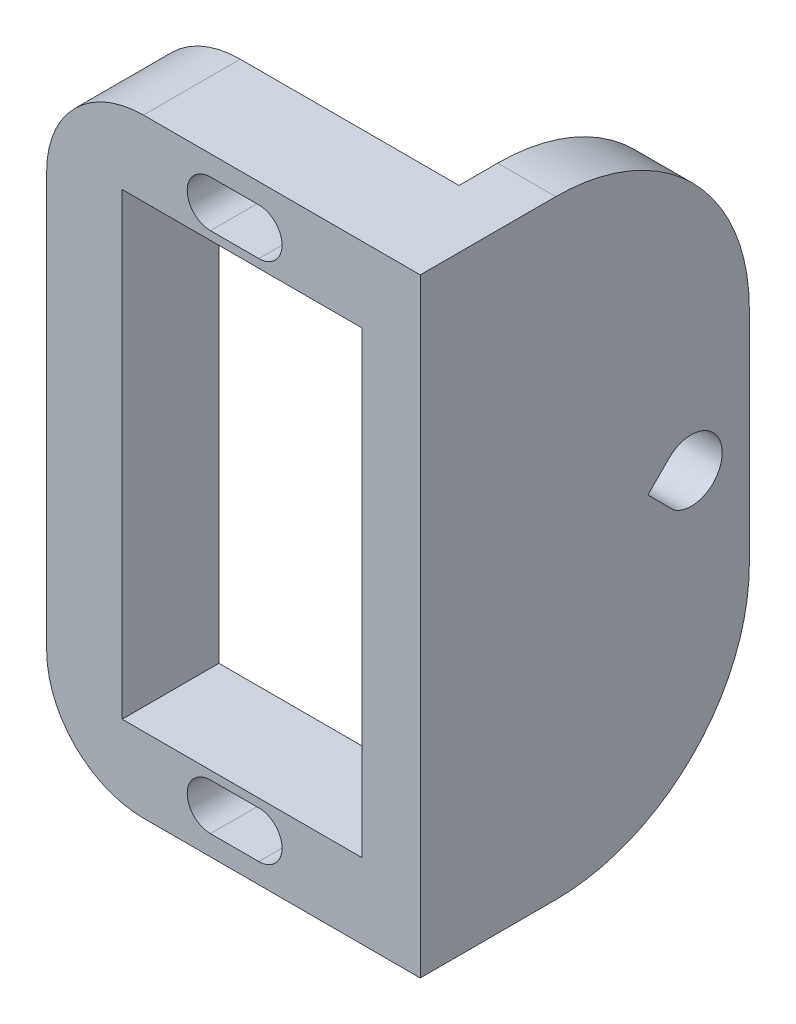
ISO-10303-21;
HEADER;
FILE_DESCRIPTION(('STEP AP214'),'2;1');
FILE_NAME('part.step','',(''),(''),'','','');
FILE_SCHEMA(('AUTOMOTIVE_DESIGN { 1 0 10303 214 1 1 1 1 }'));
ENDSEC;
DATA;
#1=APPLICATION_CONTEXT('core data for automotive mechanical design processes');
#2=APPLICATION_PROTOCOL_DEFINITION('international standard','automotive_design',2000,#1);
#3=PRODUCT_CONTEXT('',#1,'mechanical');
#4=PRODUCT('Part','Part','',(#3));
#5=PRODUCT_RELATED_PRODUCT_CATEGORY('part','',(#4));
#6=PRODUCT_DEFINITION_FORMATION('','',#4);
#7=PRODUCT_DEFINITION_CONTEXT('part definition',#1,'design');
#8=PRODUCT_DEFINITION('design','',#6,#7);
#9=PRODUCT_DEFINITION_SHAPE('','',#8);
#10=(LENGTH_UNIT() NAMED_UNIT(*) SI_UNIT(.MILLI.,.METRE.));
#11=(NAMED_UNIT(*) PLANE_ANGLE_UNIT() SI_UNIT($,.RADIAN.));
#12=(NAMED_UNIT(*) SI_UNIT($,.STERADIAN.) SOLID_ANGLE_UNIT());
#13=UNCERTAINTY_MEASURE_WITH_UNIT(LENGTH_MEASURE(1.E-05),#10,'distance_accuracy_value','');
#14=(GEOMETRIC_REPRESENTATION_CONTEXT(3) GLOBAL_UNCERTAINTY_ASSIGNED_CONTEXT((#13)) GLOBAL_UNIT_ASSIGNED_CONTEXT((#10,
#11,#12)) REPRESENTATION_CONTEXT('',''));
#15=CARTESIAN_POINT('',(0.,0.,0.));
#16=DIRECTION('',(0.,0.,1.));
#17=DIRECTION('',(1.,0.,0.));
#18=AXIS2_PLACEMENT_3D('',#15,#16,#17);
#19=CARTESIAN_POINT('',(12.4,11.85,5.));
#20=DIRECTION('',(0.,1.,0.));
#21=DIRECTION('',(0.,0.,1.));
#22=AXIS2_PLACEMENT_3D('',#19,#20,#21);
#23=PLANE('',#22);
#24=DIRECTION('',(0.,0.,-1.));
#25=VECTOR('',#24,1.);
#26=CARTESIAN_POINT('',(12.4,11.85,5.));
#27=LINE('',#26,#25);
#28=CARTESIAN_POINT('',(12.4,11.85,5.));
#29=VERTEX_POINT('',#28);
#30=CARTESIAN_POINT('',(12.4,11.85,0.));
#31=VERTEX_POINT('',#30);
#32=EDGE_CURVE('E263',#29,#31,#27,.T.);
#33=ORIENTED_EDGE('',*,*,#32,.F.);
#34=DIRECTION('',(1.,0.,0.));
#35=VECTOR('',#34,1.);
#36=CARTESIAN_POINT('',(0.,11.85,5.));
#37=LINE('',#36,#35);
#38=CARTESIAN_POINT('',(0.,11.85,5.));
#39=VERTEX_POINT('',#38);
#40=EDGE_CURVE('E381',#39,#29,#37,.T.);
#41=ORIENTED_EDGE('',*,*,#40,.F.);
#42=DIRECTION('',(0.,0.,-1.));
#43=VECTOR('',#42,1.);
#44=CARTESIAN_POINT('',(0.,11.85,5.));
#45=LINE('',#44,#43);
#46=CARTESIAN_POINT('',(0.,11.85,0.));
#47=VERTEX_POINT('',#46);
#48=EDGE_CURVE('E404',#39,#47,#45,.T.);
#49=ORIENTED_EDGE('',*,*,#48,.T.);
#50=DIRECTION('',(1.,0.,0.));
#51=VECTOR('',#50,1.);
#52=CARTESIAN_POINT('',(12.4,11.85,0.));
#53=LINE('',#52,#51);
#54=EDGE_CURVE('E329',#47,#31,#53,.T.);
#55=ORIENTED_EDGE('',*,*,#54,.T.);
#56=EDGE_LOOP('',(#33,#41,#49,#55));
#57=FACE_BOUND('',#56,.T.);
#58=ADVANCED_FACE('F47',(#57),#23,.F.);
#59=CARTESIAN_POINT('',(0.,-11.85,5.));
#60=DIRECTION('',(0.,-1.,0.));
#61=DIRECTION('',(1.,0.,0.));
#62=AXIS2_PLACEMENT_3D('',#59,#60,#61);
#63=PLANE('',#62);
#64=DIRECTION('',(0.,0.,-1.));
#65=VECTOR('',#64,1.);
#66=CARTESIAN_POINT('',(12.4,-11.85,5.));
#67=LINE('',#66,#65);
#68=CARTESIAN_POINT('',(12.4,-11.85,5.));
#69=VERTEX_POINT('',#68);
#70=CARTESIAN_POINT('',(12.4,-11.85,0.));
#71=VERTEX_POINT('',#70);
#72=EDGE_CURVE('E266',#69,#71,#67,.T.);
#73=ORIENTED_EDGE('',*,*,#72,.T.);
#74=DIRECTION('',(-1.,0.,0.));
#75=VECTOR('',#74,1.);
#76=CARTESIAN_POINT('',(0.,-11.85,0.));
#77=LINE('',#76,#75);
#78=CARTESIAN_POINT('',(0.,-11.85,0.));
#79=VERTEX_POINT('',#78);
#80=EDGE_CURVE('E417',#71,#79,#77,.T.);
#81=ORIENTED_EDGE('',*,*,#80,.T.);
#82=DIRECTION('',(0.,0.,-1.));
#83=VECTOR('',#82,1.);
#84=CARTESIAN_POINT('',(0.,-11.85,5.));
#85=LINE('',#84,#83);
#86=CARTESIAN_POINT('',(0.,-11.85,5.));
#87=VERTEX_POINT('',#86);
#88=EDGE_CURVE('E426',#87,#79,#85,.T.);
#89=ORIENTED_EDGE('',*,*,#88,.F.);
#90=DIRECTION('',(-1.,0.,0.));
#91=VECTOR('',#90,1.);
#92=CARTESIAN_POINT('',(12.4,-11.85,5.));
#93=LINE('',#92,#91);
#94=EDGE_CURVE('E398',#69,#87,#93,.T.);
#95=ORIENTED_EDGE('',*,*,#94,.F.);
#96=EDGE_LOOP('',(#73,#81,#89,#95));
#97=FACE_BOUND('',#96,.T.);
#98=ADVANCED_FACE('F547',(#97),#63,.F.);
#99=CARTESIAN_POINT('',(0.,0.,0.));
#100=DIRECTION('',(0.,0.,-1.));
#101=DIRECTION('',(-1.,0.,0.));
#102=AXIS2_PLACEMENT_3D('',#99,#100,#101);
#103=PLANE('',#102);
#104=CARTESIAN_POINT('',(4.56,-13.49,0.));
#105=DIRECTION('',(0.,0.,1.));
#106=DIRECTION('',(1.,0.,0.));
#107=AXIS2_PLACEMENT_3D('',#104,#105,#106);
#108=CIRCLE('',#107,1.2);
#109=CARTESIAN_POINT('',(4.56,-12.29,0.));
#110=VERTEX_POINT('',#109);
#111=CARTESIAN_POINT('',(4.56,-14.69,0.));
#112=VERTEX_POINT('',#111);
#113=EDGE_CURVE('E293',#110,#112,#108,.T.);
#114=ORIENTED_EDGE('',*,*,#113,.T.);
#115=DIRECTION('',(1.,0.,0.));
#116=VECTOR('',#115,1.);
#117=CARTESIAN_POINT('',(4.56,-14.69,0.));
#118=LINE('',#117,#116);
#119=CARTESIAN_POINT('',(7.06,-14.69,0.));
#120=VERTEX_POINT('',#119);
#121=EDGE_CURVE('E297',#112,#120,#118,.T.);
#122=ORIENTED_EDGE('',*,*,#121,.T.);
#123=CARTESIAN_POINT('',(7.06,-13.49,0.));
#124=DIRECTION('',(0.,0.,1.));
#125=DIRECTION('',(1.,0.,0.));
#126=AXIS2_PLACEMENT_3D('',#123,#124,#125);
#127=CIRCLE('',#126,1.2);
#128=CARTESIAN_POINT('',(7.06,-12.29,0.));
#129=VERTEX_POINT('',#128);
#130=EDGE_CURVE('E302',#120,#129,#127,.T.);
#131=ORIENTED_EDGE('',*,*,#130,.T.);
#132=DIRECTION('',(-1.,0.,0.));
#133=VECTOR('',#132,1.);
#134=CARTESIAN_POINT('',(4.56,-12.29,0.));
#135=LINE('',#134,#133);
#136=EDGE_CURVE('E306',#129,#110,#135,.T.);
#137=ORIENTED_EDGE('',*,*,#136,.T.);
#138=EDGE_LOOP('',(#114,#122,#131,#137));
#139=FACE_BOUND('',#138,.T.);
#140=CARTESIAN_POINT('',(4.56,13.49,0.));
#141=DIRECTION('',(0.,0.,1.));
#142=DIRECTION('',(-1.,0.,0.));
#143=AXIS2_PLACEMENT_3D('',#140,#141,#142);
#144=CIRCLE('',#143,1.2);
#145=CARTESIAN_POINT('',(4.56,14.69,0.));
#146=VERTEX_POINT('',#145);
#147=CARTESIAN_POINT('',(4.56,12.29,0.));
#148=VERTEX_POINT('',#147);
#149=EDGE_CURVE('E357',#146,#148,#144,.T.);
#150=ORIENTED_EDGE('',*,*,#149,.T.);
#151=DIRECTION('',(1.,0.,0.));
#152=VECTOR('',#151,1.);
#153=CARTESIAN_POINT('',(4.56,12.29,0.));
#154=LINE('',#153,#152);
#155=CARTESIAN_POINT('',(7.06,12.29,0.));
#156=VERTEX_POINT('',#155);
#157=EDGE_CURVE('E374',#148,#156,#154,.T.);
#158=ORIENTED_EDGE('',*,*,#157,.T.);
#159=CARTESIAN_POINT('',(7.06,13.49,0.));
#160=DIRECTION('',(0.,0.,1.));
#161=DIRECTION('',(-1.,0.,0.));
#162=AXIS2_PLACEMENT_3D('',#159,#160,#161);
#163=CIRCLE('',#162,1.2);
#164=CARTESIAN_POINT('',(7.06,14.69,0.));
#165=VERTEX_POINT('',#164);
#166=EDGE_CURVE('E370',#156,#165,#163,.T.);
#167=ORIENTED_EDGE('',*,*,#166,.T.);
#168=DIRECTION('',(-1.,0.,0.));
#169=VECTOR('',#168,1.);
#170=CARTESIAN_POINT('',(4.56,14.69,0.));
#171=LINE('',#170,#169);
#172=EDGE_CURVE('E343',#165,#146,#171,.T.);
#173=ORIENTED_EDGE('',*,*,#172,.T.);
#174=EDGE_LOOP('',(#150,#158,#167,#173));
#175=FACE_BOUND('',#174,.T.);
#176=DIRECTION('',(1.,0.,0.));
#177=VECTOR('',#176,1.);
#178=CARTESIAN_POINT('',(12.4,-15.73,0.));
#179=LINE('',#178,#177);
#180=CARTESIAN_POINT('',(1.1,-15.73,0.));
#181=VERTEX_POINT('',#180);
#182=CARTESIAN_POINT('',(12.4,-15.73,0.));
#183=VERTEX_POINT('',#182);
#184=EDGE_CURVE('E414',#181,#183,#179,.T.);
#185=ORIENTED_EDGE('',*,*,#184,.F.);
#186=CARTESIAN_POINT('',(1.1,-10.73,0.));
#187=DIRECTION('',(0.,0.,-1.));
#188=DIRECTION('',(-1.,0.,0.));
#189=AXIS2_PLACEMENT_3D('',#186,#187,#188);
#190=CIRCLE('',#189,5.);
#191=CARTESIAN_POINT('',(-3.9,-10.73,0.));
#192=VERTEX_POINT('',#191);
#193=EDGE_CURVE('E471',#181,#192,#190,.T.);
#194=ORIENTED_EDGE('',*,*,#193,.T.);
#195=DIRECTION('',(0.,-1.,0.));
#196=VECTOR('',#195,1.);
#197=CARTESIAN_POINT('',(-3.9,-15.73,0.));
#198=LINE('',#197,#196);
#199=CARTESIAN_POINT('',(-3.9,10.73,0.));
#200=VERTEX_POINT('',#199);
#201=EDGE_CURVE('E411',#200,#192,#198,.T.);
#202=ORIENTED_EDGE('',*,*,#201,.F.);
#203=CARTESIAN_POINT('',(1.1,10.73,0.));
#204=DIRECTION('',(0.,0.,-1.));
#205=DIRECTION('',(-1.,0.,0.));
#206=AXIS2_PLACEMENT_3D('',#203,#204,#205);
#207=CIRCLE('',#206,5.);
#208=CARTESIAN_POINT('',(1.1,15.73,0.));
#209=VERTEX_POINT('',#208);
#210=EDGE_CURVE('E468',#200,#209,#207,.T.);
#211=ORIENTED_EDGE('',*,*,#210,.T.);
#212=DIRECTION('',(-1.,0.,0.));
#213=VECTOR('',#212,1.);
#214=CARTESIAN_POINT('',(0.0999999999999994,15.73,0.));
#215=LINE('',#214,#213);
#216=CARTESIAN_POINT('',(12.4,15.73,0.));
#217=VERTEX_POINT('',#216);
#218=EDGE_CURVE('E408',#217,#209,#215,.T.);
#219=ORIENTED_EDGE('',*,*,#218,.F.);
#220=DIRECTION('',(0.,-1.,0.));
#221=VECTOR('',#220,1.);
#222=CARTESIAN_POINT('',(12.4,0.,0.));
#223=LINE('',#222,#221);
#224=EDGE_CURVE('E275',#217,#31,#223,.T.);
#225=ORIENTED_EDGE('',*,*,#224,.T.);
#226=ORIENTED_EDGE('',*,*,#54,.F.);
#227=DIRECTION('',(0.,1.,0.));
#228=VECTOR('',#227,1.);
#229=CARTESIAN_POINT('',(0.,-11.85,0.));
#230=LINE('',#229,#228);
#231=EDGE_CURVE('E386',#79,#47,#230,.T.);
#232=ORIENTED_EDGE('',*,*,#231,.F.);
#233=ORIENTED_EDGE('',*,*,#80,.F.);
#234=DIRECTION('',(0.,1.,0.));
#235=VECTOR('',#234,1.);
#236=CARTESIAN_POINT('',(12.4,-15.73,0.));
#237=LINE('',#236,#235);
#238=EDGE_CURVE('E283',#183,#71,#237,.T.);
#239=ORIENTED_EDGE('',*,*,#238,.F.);
#240=EDGE_LOOP('',(#185,#194,#202,#211,#219,#225,#226,#232,#233,#239));
#241=FACE_BOUND('',#240,.T.);
#242=ADVANCED_FACE('F497',(#139,#175,#241),#103,.T.);
#243=CARTESIAN_POINT('',(0.0999999999999994,15.73,5.));
#244=DIRECTION('',(0.,-1.,0.));
#245=DIRECTION('',(0.,0.,-1.));
#246=AXIS2_PLACEMENT_3D('',#243,#244,#245);
#247=PLANE('',#246);
#248=ORIENTED_EDGE('',*,*,#218,.T.);
#249=DIRECTION('',(0.,0.,-1.));
#250=VECTOR('',#249,1.);
#251=CARTESIAN_POINT('',(1.1,15.73,5.));
#252=LINE('',#251,#250);
#253=CARTESIAN_POINT('',(1.1,15.73,5.));
#254=VERTEX_POINT('',#253);
#255=EDGE_CURVE('E11',#209,#254,#252,.F.);
#256=ORIENTED_EDGE('',*,*,#255,.T.);
#257=DIRECTION('',(-1.,0.,0.));
#258=VECTOR('',#257,1.);
#259=CARTESIAN_POINT('',(12.4,15.73,5.));
#260=LINE('',#259,#258);
#261=CARTESIAN_POINT('',(15.4,15.73,5.));
#262=VERTEX_POINT('',#261);
#263=EDGE_CURVE('E389',#262,#254,#260,.T.);
#264=ORIENTED_EDGE('',*,*,#263,.F.);
#265=DIRECTION('',(0.,0.,-1.));
#266=VECTOR('',#265,1.);
#267=CARTESIAN_POINT('',(15.4,15.73,5.));
#268=LINE('',#267,#266);
#269=CARTESIAN_POINT('',(15.4,15.73,-2.));
#270=VERTEX_POINT('',#269);
#271=EDGE_CURVE('E434',#262,#270,#268,.T.);
#272=ORIENTED_EDGE('',*,*,#271,.T.);
#273=DIRECTION('',(1.,0.,0.));
#274=VECTOR('',#273,1.);
#275=CARTESIAN_POINT('',(12.4,15.73,-2.));
#276=LINE('',#275,#274);
#277=CARTESIAN_POINT('',(12.4,15.73,-2.));
#278=VERTEX_POINT('',#277);
#279=EDGE_CURVE('E461',#270,#278,#276,.F.);
#280=ORIENTED_EDGE('',*,*,#279,.T.);
#281=DIRECTION('',(0.,0.,1.));
#282=VECTOR('',#281,1.);
#283=CARTESIAN_POINT('',(12.4,15.73,-12.));
#284=LINE('',#283,#282);
#285=EDGE_CURVE('E279',#278,#217,#284,.T.);
#286=ORIENTED_EDGE('',*,*,#285,.T.);
#287=EDGE_LOOP('',(#248,#256,#264,#272,#280,#286));
#288=FACE_BOUND('',#287,.T.);
#289=ADVANCED_FACE('F504',(#288),#247,.F.);
#290=CARTESIAN_POINT('',(-3.9,-15.73,5.));
#291=DIRECTION('',(1.,0.,0.));
#292=DIRECTION('',(0.,0.,-1.));
#293=AXIS2_PLACEMENT_3D('',#290,#291,#292);
#294=PLANE('',#293);
#295=ORIENTED_EDGE('',*,*,#201,.T.);
#296=DIRECTION('',(0.,0.,-1.));
#297=VECTOR('',#296,1.);
#298=CARTESIAN_POINT('',(-3.9,-10.73,5.));
#299=LINE('',#298,#297);
#300=CARTESIAN_POINT('',(-3.9,-10.73,5.));
#301=VERTEX_POINT('',#300);
#302=EDGE_CURVE('E69',#192,#301,#299,.F.);
#303=ORIENTED_EDGE('',*,*,#302,.T.);
#304=DIRECTION('',(0.,-1.,0.));
#305=VECTOR('',#304,1.);
#306=CARTESIAN_POINT('',(-3.9,-15.73,5.));
#307=LINE('',#306,#305);
#308=CARTESIAN_POINT('',(-3.9,10.73,5.));
#309=VERTEX_POINT('',#308);
#310=EDGE_CURVE('E392',#309,#301,#307,.T.);
#311=ORIENTED_EDGE('',*,*,#310,.F.);
#312=DIRECTION('',(0.,0.,-1.));
#313=VECTOR('',#312,1.);
#314=CARTESIAN_POINT('',(-3.9,10.73,5.));
#315=LINE('',#314,#313);
#316=EDGE_CURVE('E474',#309,#200,#315,.T.);
#317=ORIENTED_EDGE('',*,*,#316,.T.);
#318=EDGE_LOOP('',(#295,#303,#311,#317));
#319=FACE_BOUND('',#318,.T.);
#320=ADVANCED_FACE('F499',(#319),#294,.F.);
#321=CARTESIAN_POINT('',(12.4,-15.73,5.));
#322=DIRECTION('',(0.,1.,0.));
#323=DIRECTION('',(0.,0.,1.));
#324=AXIS2_PLACEMENT_3D('',#321,#322,#323);
#325=PLANE('',#324);
#326=DIRECTION('',(1.,0.,0.));
#327=VECTOR('',#326,1.);
#328=CARTESIAN_POINT('',(0.0999999999999994,-15.73,5.));
#329=LINE('',#328,#327);
#330=CARTESIAN_POINT('',(1.1,-15.73,5.));
#331=VERTEX_POINT('',#330);
#332=CARTESIAN_POINT('',(15.4,-15.73,5.));
#333=VERTEX_POINT('',#332);
#334=EDGE_CURVE('E395',#331,#333,#329,.T.);
#335=ORIENTED_EDGE('',*,*,#334,.F.);
#336=DIRECTION('',(0.,0.,-1.));
#337=VECTOR('',#336,1.);
#338=CARTESIAN_POINT('',(1.1,-15.73,5.));
#339=LINE('',#338,#337);
#340=EDGE_CURVE('E464',#331,#181,#339,.T.);
#341=ORIENTED_EDGE('',*,*,#340,.T.);
#342=ORIENTED_EDGE('',*,*,#184,.T.);
#343=DIRECTION('',(0.,0.,1.));
#344=VECTOR('',#343,1.);
#345=CARTESIAN_POINT('',(12.4,-15.73,-12.));
#346=LINE('',#345,#344);
#347=CARTESIAN_POINT('',(12.4,-15.73,-2.));
#348=VERTEX_POINT('',#347);
#349=EDGE_CURVE('E269',#348,#183,#346,.T.);
#350=ORIENTED_EDGE('',*,*,#349,.F.);
#351=DIRECTION('',(-1.,0.,0.));
#352=VECTOR('',#351,1.);
#353=CARTESIAN_POINT('',(15.4,-15.73,-2.));
#354=LINE('',#353,#352);
#355=CARTESIAN_POINT('',(15.4,-15.73,-2.));
#356=VERTEX_POINT('',#355);
#357=EDGE_CURVE('E452',#348,#356,#354,.F.);
#358=ORIENTED_EDGE('',*,*,#357,.T.);
#359=DIRECTION('',(0.,0.,-1.));
#360=VECTOR('',#359,1.);
#361=CARTESIAN_POINT('',(15.4,-15.73,5.));
#362=LINE('',#361,#360);
#363=EDGE_CURVE('E430',#333,#356,#362,.T.);
#364=ORIENTED_EDGE('',*,*,#363,.F.);
#365=EDGE_LOOP('',(#335,#341,#342,#350,#358,#364));
#366=FACE_BOUND('',#365,.T.);
#367=ADVANCED_FACE('F492',(#366),#325,.F.);
#368=CARTESIAN_POINT('',(15.4,-15.73,5.));
#369=DIRECTION('',(-1.,0.,0.));
#370=DIRECTION('',(0.,-1.,0.));
#371=AXIS2_PLACEMENT_3D('',#368,#369,#370);
#372=PLANE('',#371);
#373=CARTESIAN_POINT('',(15.4,-0.0223725350179636,-9.));
#374=DIRECTION('',(-1.,0.,0.));
#375=DIRECTION('',(0.,0.,1.));
#376=AXIS2_PLACEMENT_3D('',#373,#374,#375);
#377=CIRCLE('',#376,1.6);
#378=CARTESIAN_POINT('',(15.4,1.10899831488052,-7.86862915010153));
#379=VERTEX_POINT('',#378);
#380=CARTESIAN_POINT('',(15.4,-1.35525192902797,-8.11488276424898));
#381=VERTEX_POINT('',#380);
#382=EDGE_CURVE('E230',#379,#381,#377,.T.);
#383=ORIENTED_EDGE('',*,*,#382,.T.);
#384=DIRECTION('',(0.,0.707106781186543,0.707106781186552));
#385=VECTOR('',#384,1.);
#386=CARTESIAN_POINT('',(15.4,0.,-6.759630835221));
#387=LINE('',#386,#385);
#388=CARTESIAN_POINT('',(15.4,0.,-6.759630835221));
#389=VERTEX_POINT('',#388);
#390=EDGE_CURVE('E221',#381,#389,#387,.T.);
#391=ORIENTED_EDGE('',*,*,#390,.T.);
#392=DIRECTION('',(0.,0.707106781186543,-0.707106781186552));
#393=VECTOR('',#392,1.);
#394=CARTESIAN_POINT('',(15.4,0.,-6.759630835221));
#395=LINE('',#394,#393);
#396=EDGE_CURVE('E234',#389,#379,#395,.T.);
#397=ORIENTED_EDGE('',*,*,#396,.T.);
#398=EDGE_LOOP('',(#383,#391,#397));
#399=FACE_BOUND('',#398,.T.);
#400=ORIENTED_EDGE('',*,*,#363,.T.);
#401=CARTESIAN_POINT('',(15.4,-5.73,-2.));
#402=DIRECTION('',(-1.,0.,0.));
#403=DIRECTION('',(0.,-1.,0.));
#404=AXIS2_PLACEMENT_3D('',#401,#402,#403);
#405=CIRCLE('',#404,10.);
#406=CARTESIAN_POINT('',(15.4,-5.73,-12.));
#407=VERTEX_POINT('',#406);
#408=EDGE_CURVE('E458',#356,#407,#405,.F.);
#409=ORIENTED_EDGE('',*,*,#408,.T.);
#410=DIRECTION('',(0.,-1.,0.));
#411=VECTOR('',#410,1.);
#412=CARTESIAN_POINT('',(15.4,0.,-12.));
#413=LINE('',#412,#411);
#414=CARTESIAN_POINT('',(15.4,5.73000000000001,-12.));
#415=VERTEX_POINT('',#414);
#416=EDGE_CURVE('E274',#415,#407,#413,.T.);
#417=ORIENTED_EDGE('',*,*,#416,.F.);
#418=CARTESIAN_POINT('',(15.4,5.73000000000001,-2.));
#419=DIRECTION('',(-1.,0.,0.));
#420=DIRECTION('',(0.,-1.,0.));
#421=AXIS2_PLACEMENT_3D('',#418,#419,#420);
#422=CIRCLE('',#421,10.);
#423=EDGE_CURVE('E455',#415,#270,#422,.F.);
#424=ORIENTED_EDGE('',*,*,#423,.T.);
#425=ORIENTED_EDGE('',*,*,#271,.F.);
#426=DIRECTION('',(0.,1.,0.));
#427=VECTOR('',#426,1.);
#428=CARTESIAN_POINT('',(15.4,15.73,5.));
#429=LINE('',#428,#427);
#430=EDGE_CURVE('E385',#333,#262,#429,.T.);
#431=ORIENTED_EDGE('',*,*,#430,.F.);
#432=EDGE_LOOP('',(#400,#409,#417,#424,#425,#431));
#433=FACE_BOUND('',#432,.T.);
#434=ADVANCED_FACE('F239',(#399,#433),#372,.F.);
#435=CARTESIAN_POINT('',(0.,-11.85,5.));
#436=DIRECTION('',(-1.,0.,0.));
#437=DIRECTION('',(0.,-1.,0.));
#438=AXIS2_PLACEMENT_3D('',#435,#436,#437);
#439=PLANE('',#438);
#440=ORIENTED_EDGE('',*,*,#231,.T.);
#441=ORIENTED_EDGE('',*,*,#48,.F.);
#442=DIRECTION('',(0.,1.,0.));
#443=VECTOR('',#442,1.);
#444=CARTESIAN_POINT('',(0.,-11.85,5.));
#445=LINE('',#444,#443);
#446=EDGE_CURVE('E401',#87,#39,#445,.T.);
#447=ORIENTED_EDGE('',*,*,#446,.F.);
#448=ORIENTED_EDGE('',*,*,#88,.T.);
#449=EDGE_LOOP('',(#440,#441,#447,#448));
#450=FACE_BOUND('',#449,.T.);
#451=ADVANCED_FACE('F518',(#450),#439,.F.);
#452=CARTESIAN_POINT('',(0.,0.,5.));
#453=DIRECTION('',(0.,0.,-1.));
#454=DIRECTION('',(-1.,0.,0.));
#455=AXIS2_PLACEMENT_3D('',#452,#453,#454);
#456=PLANE('',#455);
#457=DIRECTION('',(0.,-1.,0.));
#458=VECTOR('',#457,1.);
#459=CARTESIAN_POINT('',(12.4,11.85,5.));
#460=LINE('',#459,#458);
#461=EDGE_CURVE('E258',#29,#69,#460,.T.);
#462=ORIENTED_EDGE('',*,*,#461,.T.);
#463=ORIENTED_EDGE('',*,*,#94,.T.);
#464=ORIENTED_EDGE('',*,*,#446,.T.);
#465=ORIENTED_EDGE('',*,*,#40,.T.);
#466=EDGE_LOOP('',(#462,#463,#464,#465));
#467=FACE_BOUND('',#466,.T.);
#468=DIRECTION('',(1.,0.,0.));
#469=VECTOR('',#468,1.);
#470=CARTESIAN_POINT('',(4.56,-14.69,5.));
#471=LINE('',#470,#469);
#472=CARTESIAN_POINT('',(4.56,-14.69,5.));
#473=VERTEX_POINT('',#472);
#474=CARTESIAN_POINT('',(7.06,-14.69,5.));
#475=VERTEX_POINT('',#474);
#476=EDGE_CURVE('E314',#473,#475,#471,.T.);
#477=ORIENTED_EDGE('',*,*,#476,.F.);
#478=CARTESIAN_POINT('',(4.56,-13.49,5.));
#479=DIRECTION('',(0.,0.,1.));
#480=DIRECTION('',(1.,0.,0.));
#481=AXIS2_PLACEMENT_3D('',#478,#479,#480);
#482=CIRCLE('',#481,1.2);
#483=CARTESIAN_POINT('',(4.56,-12.29,5.));
#484=VERTEX_POINT('',#483);
#485=EDGE_CURVE('E311',#484,#473,#482,.T.);
#486=ORIENTED_EDGE('',*,*,#485,.F.);
#487=DIRECTION('',(-1.,0.,0.));
#488=VECTOR('',#487,1.);
#489=CARTESIAN_POINT('',(4.56,-12.29,5.));
#490=LINE('',#489,#488);
#491=CARTESIAN_POINT('',(7.06,-12.29,5.));
#492=VERTEX_POINT('',#491);
#493=EDGE_CURVE('E298',#492,#484,#490,.T.);
#494=ORIENTED_EDGE('',*,*,#493,.F.);
#495=CARTESIAN_POINT('',(7.06,-13.49,5.));
#496=DIRECTION('',(0.,0.,1.));
#497=DIRECTION('',(1.,0.,0.));
#498=AXIS2_PLACEMENT_3D('',#495,#496,#497);
#499=CIRCLE('',#498,1.2);
#500=EDGE_CURVE('E319',#475,#492,#499,.T.);
#501=ORIENTED_EDGE('',*,*,#500,.F.);
#502=EDGE_LOOP('',(#477,#486,#494,#501));
#503=FACE_BOUND('',#502,.T.);
#504=DIRECTION('',(1.,0.,0.));
#505=VECTOR('',#504,1.);
#506=CARTESIAN_POINT('',(4.56,12.29,5.));
#507=LINE('',#506,#505);
#508=CARTESIAN_POINT('',(4.56,12.29,5.));
#509=VERTEX_POINT('',#508);
#510=CARTESIAN_POINT('',(7.06,12.29,5.));
#511=VERTEX_POINT('',#510);
#512=EDGE_CURVE('E361',#509,#511,#507,.T.);
#513=ORIENTED_EDGE('',*,*,#512,.F.);
#514=CARTESIAN_POINT('',(4.56,13.49,5.));
#515=DIRECTION('',(0.,0.,1.));
#516=DIRECTION('',(-1.,0.,0.));
#517=AXIS2_PLACEMENT_3D('',#514,#515,#516);
#518=CIRCLE('',#517,1.2);
#519=CARTESIAN_POINT('',(4.56,14.69,5.));
#520=VERTEX_POINT('',#519);
#521=EDGE_CURVE('E315',#520,#509,#518,.T.);
#522=ORIENTED_EDGE('',*,*,#521,.F.);
#523=DIRECTION('',(-1.,0.,0.));
#524=VECTOR('',#523,1.);
#525=CARTESIAN_POINT('',(4.56,14.69,5.));
#526=LINE('',#525,#524);
#527=CARTESIAN_POINT('',(7.06,14.69,5.));
#528=VERTEX_POINT('',#527);
#529=EDGE_CURVE('E352',#528,#520,#526,.T.);
#530=ORIENTED_EDGE('',*,*,#529,.F.);
#531=CARTESIAN_POINT('',(7.06,13.49,5.));
#532=DIRECTION('',(0.,0.,1.));
#533=DIRECTION('',(-1.,0.,0.));
#534=AXIS2_PLACEMENT_3D('',#531,#532,#533);
#535=CIRCLE('',#534,1.2);
#536=EDGE_CURVE('E356',#511,#528,#535,.T.);
#537=ORIENTED_EDGE('',*,*,#536,.F.);
#538=EDGE_LOOP('',(#513,#522,#530,#537));
#539=FACE_BOUND('',#538,.T.);
#540=ORIENTED_EDGE('',*,*,#310,.T.);
#541=CARTESIAN_POINT('',(1.1,-10.73,5.));
#542=DIRECTION('',(0.,0.,-1.));
#543=DIRECTION('',(-1.,0.,0.));
#544=AXIS2_PLACEMENT_3D('',#541,#542,#543);
#545=CIRCLE('',#544,5.);
#546=EDGE_CURVE('E56',#301,#331,#545,.F.);
#547=ORIENTED_EDGE('',*,*,#546,.T.);
#548=ORIENTED_EDGE('',*,*,#334,.T.);
#549=ORIENTED_EDGE('',*,*,#430,.T.);
#550=ORIENTED_EDGE('',*,*,#263,.T.);
#551=CARTESIAN_POINT('',(1.1,10.73,5.));
#552=DIRECTION('',(0.,0.,-1.));
#553=DIRECTION('',(-1.,0.,0.));
#554=AXIS2_PLACEMENT_3D('',#551,#552,#553);
#555=CIRCLE('',#554,5.);
#556=EDGE_CURVE('E480',#254,#309,#555,.F.);
#557=ORIENTED_EDGE('',*,*,#556,.T.);
#558=EDGE_LOOP('',(#540,#547,#548,#549,#550,#557));
#559=FACE_BOUND('',#558,.T.);
#560=ADVANCED_FACE('F486',(#467,#503,#539,#559),#456,.F.);
#561=CARTESIAN_POINT('',(4.56,13.49,0.));
#562=DIRECTION('',(0.,0.,1.));
#563=DIRECTION('',(1.,0.,0.));
#564=AXIS2_PLACEMENT_3D('',#561,#562,#563);
#565=CYLINDRICAL_SURFACE('',#564,1.2);
#566=ORIENTED_EDGE('',*,*,#521,.T.);
#567=DIRECTION('',(0.,0.,1.));
#568=VECTOR('',#567,1.);
#569=CARTESIAN_POINT('',(4.56,12.29,0.));
#570=LINE('',#569,#568);
#571=EDGE_CURVE('E339',#148,#509,#570,.T.);
#572=ORIENTED_EDGE('',*,*,#571,.F.);
#573=ORIENTED_EDGE('',*,*,#149,.F.);
#574=DIRECTION('',(0.,0.,1.));
#575=VECTOR('',#574,1.);
#576=CARTESIAN_POINT('',(4.56,14.69,0.));
#577=LINE('',#576,#575);
#578=EDGE_CURVE('E286',#146,#520,#577,.T.);
#579=ORIENTED_EDGE('',*,*,#578,.T.);
#580=EDGE_LOOP('',(#566,#572,#573,#579));
#581=FACE_BOUND('',#580,.T.);
#582=ADVANCED_FACE('F569',(#581),#565,.F.);
#583=CARTESIAN_POINT('',(4.56,14.69,0.));
#584=DIRECTION('',(0.,1.,0.));
#585=DIRECTION('',(0.,0.,1.));
#586=AXIS2_PLACEMENT_3D('',#583,#584,#585);
#587=PLANE('',#586);
#588=ORIENTED_EDGE('',*,*,#529,.T.);
#589=ORIENTED_EDGE('',*,*,#578,.F.);
#590=ORIENTED_EDGE('',*,*,#172,.F.);
#591=DIRECTION('',(0.,0.,1.));
#592=VECTOR('',#591,1.);
#593=CARTESIAN_POINT('',(7.06,14.69,0.));
#594=LINE('',#593,#592);
#595=EDGE_CURVE('E347',#165,#528,#594,.T.);
#596=ORIENTED_EDGE('',*,*,#595,.T.);
#597=EDGE_LOOP('',(#588,#589,#590,#596));
#598=FACE_BOUND('',#597,.T.);
#599=ADVANCED_FACE('F571',(#598),#587,.F.);
#600=CARTESIAN_POINT('',(7.06,13.49,0.));
#601=DIRECTION('',(0.,0.,1.));
#602=DIRECTION('',(1.,0.,0.));
#603=AXIS2_PLACEMENT_3D('',#600,#601,#602);
#604=CYLINDRICAL_SURFACE('',#603,1.2);
#605=ORIENTED_EDGE('',*,*,#536,.T.);
#606=ORIENTED_EDGE('',*,*,#595,.F.);
#607=ORIENTED_EDGE('',*,*,#166,.F.);
#608=DIRECTION('',(0.,0.,1.));
#609=VECTOR('',#608,1.);
#610=CARTESIAN_POINT('',(7.06,12.29,0.));
#611=LINE('',#610,#609);
#612=EDGE_CURVE('E344',#156,#511,#611,.T.);
#613=ORIENTED_EDGE('',*,*,#612,.T.);
#614=EDGE_LOOP('',(#605,#606,#607,#613));
#615=FACE_BOUND('',#614,.T.);
#616=ADVANCED_FACE('F574',(#615),#604,.F.);
#617=CARTESIAN_POINT('',(4.56,12.29,0.));
#618=DIRECTION('',(0.,-1.,0.));
#619=DIRECTION('',(1.,0.,0.));
#620=AXIS2_PLACEMENT_3D('',#617,#618,#619);
#621=PLANE('',#620);
#622=ORIENTED_EDGE('',*,*,#512,.T.);
#623=ORIENTED_EDGE('',*,*,#612,.F.);
#624=ORIENTED_EDGE('',*,*,#157,.F.);
#625=ORIENTED_EDGE('',*,*,#571,.T.);
#626=EDGE_LOOP('',(#622,#623,#624,#625));
#627=FACE_BOUND('',#626,.T.);
#628=ADVANCED_FACE('F578',(#627),#621,.F.);
#629=CARTESIAN_POINT('',(4.56,-13.49,0.));
#630=DIRECTION('',(0.,0.,1.));
#631=DIRECTION('',(1.,0.,0.));
#632=AXIS2_PLACEMENT_3D('',#629,#630,#631);
#633=CYLINDRICAL_SURFACE('',#632,1.2);
#634=ORIENTED_EDGE('',*,*,#485,.T.);
#635=DIRECTION('',(0.,0.,1.));
#636=VECTOR('',#635,1.);
#637=CARTESIAN_POINT('',(4.56,-14.69,0.));
#638=LINE('',#637,#636);
#639=EDGE_CURVE('E310',#112,#473,#638,.T.);
#640=ORIENTED_EDGE('',*,*,#639,.F.);
#641=ORIENTED_EDGE('',*,*,#113,.F.);
#642=DIRECTION('',(0.,0.,1.));
#643=VECTOR('',#642,1.);
#644=CARTESIAN_POINT('',(4.56,-12.29,0.));
#645=LINE('',#644,#643);
#646=EDGE_CURVE('E326',#110,#484,#645,.T.);
#647=ORIENTED_EDGE('',*,*,#646,.T.);
#648=EDGE_LOOP('',(#634,#640,#641,#647));
#649=FACE_BOUND('',#648,.T.);
#650=ADVANCED_FACE('F582',(#649),#633,.F.);
#651=CARTESIAN_POINT('',(4.56,-12.29,0.));
#652=DIRECTION('',(0.,1.,0.));
#653=DIRECTION('',(-1.,0.,0.));
#654=AXIS2_PLACEMENT_3D('',#651,#652,#653);
#655=PLANE('',#654);
#656=ORIENTED_EDGE('',*,*,#493,.T.);
#657=ORIENTED_EDGE('',*,*,#646,.F.);
#658=ORIENTED_EDGE('',*,*,#136,.F.);
#659=DIRECTION('',(0.,0.,1.));
#660=VECTOR('',#659,1.);
#661=CARTESIAN_POINT('',(7.06,-12.29,0.));
#662=LINE('',#661,#660);
#663=EDGE_CURVE('E330',#129,#492,#662,.T.);
#664=ORIENTED_EDGE('',*,*,#663,.T.);
#665=EDGE_LOOP('',(#656,#657,#658,#664));
#666=FACE_BOUND('',#665,.T.);
#667=ADVANCED_FACE('F589',(#666),#655,.F.);
#668=CARTESIAN_POINT('',(7.06,-13.49,0.));
#669=DIRECTION('',(0.,0.,1.));
#670=DIRECTION('',(1.,0.,0.));
#671=AXIS2_PLACEMENT_3D('',#668,#669,#670);
#672=CYLINDRICAL_SURFACE('',#671,1.2);
#673=ORIENTED_EDGE('',*,*,#500,.T.);
#674=ORIENTED_EDGE('',*,*,#663,.F.);
#675=ORIENTED_EDGE('',*,*,#130,.F.);
#676=DIRECTION('',(0.,0.,1.));
#677=VECTOR('',#676,1.);
#678=CARTESIAN_POINT('',(7.06,-14.69,0.));
#679=LINE('',#678,#677);
#680=EDGE_CURVE('E333',#120,#475,#679,.T.);
#681=ORIENTED_EDGE('',*,*,#680,.T.);
#682=EDGE_LOOP('',(#673,#674,#675,#681));
#683=FACE_BOUND('',#682,.T.);
#684=ADVANCED_FACE('F593',(#683),#672,.F.);
#685=CARTESIAN_POINT('',(4.56,-14.69,0.));
#686=DIRECTION('',(0.,-1.,0.));
#687=DIRECTION('',(0.,0.,-1.));
#688=AXIS2_PLACEMENT_3D('',#685,#686,#687);
#689=PLANE('',#688);
#690=ORIENTED_EDGE('',*,*,#476,.T.);
#691=ORIENTED_EDGE('',*,*,#680,.F.);
#692=ORIENTED_EDGE('',*,*,#121,.F.);
#693=ORIENTED_EDGE('',*,*,#639,.T.);
#694=EDGE_LOOP('',(#690,#691,#692,#693));
#695=FACE_BOUND('',#694,.T.);
#696=ADVANCED_FACE('F591',(#695),#689,.F.);
#697=CARTESIAN_POINT('',(12.4,0.,-12.));
#698=DIRECTION('',(-1.,0.,0.));
#699=DIRECTION('',(0.,0.,1.));
#700=AXIS2_PLACEMENT_3D('',#697,#698,#699);
#701=PLANE('',#700);
#702=DIRECTION('',(0.,0.707106781186543,0.707106781186552));
#703=VECTOR('',#702,1.);
#704=CARTESIAN_POINT('',(12.4,0.,-6.759630835221));
#705=LINE('',#704,#703);
#706=CARTESIAN_POINT('',(12.4,-1.35525192902797,-8.11488276424898));
#707=VERTEX_POINT('',#706);
#708=CARTESIAN_POINT('',(12.4,0.,-6.759630835221));
#709=VERTEX_POINT('',#708);
#710=EDGE_CURVE('E224',#707,#709,#705,.T.);
#711=ORIENTED_EDGE('',*,*,#710,.F.);
#712=CARTESIAN_POINT('',(12.4,-0.0223725350179636,-9.));
#713=DIRECTION('',(-1.,0.,0.));
#714=DIRECTION('',(0.,0.,1.));
#715=AXIS2_PLACEMENT_3D('',#712,#713,#714);
#716=CIRCLE('',#715,1.6);
#717=CARTESIAN_POINT('',(12.4,1.10899831488052,-7.86862915010153));
#718=VERTEX_POINT('',#717);
#719=EDGE_CURVE('E242',#718,#707,#716,.T.);
#720=ORIENTED_EDGE('',*,*,#719,.F.);
#721=DIRECTION('',(0.,0.707106781186543,-0.707106781186552));
#722=VECTOR('',#721,1.);
#723=CARTESIAN_POINT('',(12.4,0.,-6.759630835221));
#724=LINE('',#723,#722);
#725=EDGE_CURVE('E246',#709,#718,#724,.T.);
#726=ORIENTED_EDGE('',*,*,#725,.F.);
#727=EDGE_LOOP('',(#711,#720,#726));
#728=FACE_BOUND('',#727,.T.);
#729=DIRECTION('',(0.,-1.,0.));
#730=VECTOR('',#729,1.);
#731=CARTESIAN_POINT('',(12.4,0.,-12.));
#732=LINE('',#731,#730);
#733=CARTESIAN_POINT('',(12.4,5.73000000000001,-12.));
#734=VERTEX_POINT('',#733);
#735=CARTESIAN_POINT('',(12.4,-5.73,-12.));
#736=VERTEX_POINT('',#735);
#737=EDGE_CURVE('E270',#734,#736,#732,.T.);
#738=ORIENTED_EDGE('',*,*,#737,.T.);
#739=CARTESIAN_POINT('',(12.4,-5.73,-2.));
#740=DIRECTION('',(-1.,0.,0.));
#741=DIRECTION('',(0.,0.,1.));
#742=AXIS2_PLACEMENT_3D('',#739,#740,#741);
#743=CIRCLE('',#742,10.);
#744=EDGE_CURVE('E449',#736,#348,#743,.T.);
#745=ORIENTED_EDGE('',*,*,#744,.T.);
#746=ORIENTED_EDGE('',*,*,#349,.T.);
#747=ORIENTED_EDGE('',*,*,#238,.T.);
#748=ORIENTED_EDGE('',*,*,#72,.F.);
#749=ORIENTED_EDGE('',*,*,#461,.F.);
#750=ORIENTED_EDGE('',*,*,#32,.T.);
#751=ORIENTED_EDGE('',*,*,#224,.F.);
#752=ORIENTED_EDGE('',*,*,#285,.F.);
#753=CARTESIAN_POINT('',(12.4,5.73000000000001,-2.));
#754=DIRECTION('',(-1.,0.,0.));
#755=DIRECTION('',(0.,0.,1.));
#756=AXIS2_PLACEMENT_3D('',#753,#754,#755);
#757=CIRCLE('',#756,10.);
#758=EDGE_CURVE('E446',#278,#734,#757,.T.);
#759=ORIENTED_EDGE('',*,*,#758,.T.);
#760=EDGE_LOOP('',(#738,#745,#746,#747,#748,#749,#750,#751,#752,#759));
#761=FACE_BOUND('',#760,.T.);
#762=ADVANCED_FACE('F510',(#728,#761),#701,.T.);
#763=CARTESIAN_POINT('',(0.,0.,-12.));
#764=DIRECTION('',(0.,0.,-1.));
#765=DIRECTION('',(-1.,0.,0.));
#766=AXIS2_PLACEMENT_3D('',#763,#764,#765);
#767=PLANE('',#766);
#768=ORIENTED_EDGE('',*,*,#416,.T.);
#769=DIRECTION('',(-1.,0.,0.));
#770=VECTOR('',#769,1.);
#771=CARTESIAN_POINT('',(12.4,-5.73,-12.));
#772=LINE('',#771,#770);
#773=EDGE_CURVE('E442',#407,#736,#772,.T.);
#774=ORIENTED_EDGE('',*,*,#773,.T.);
#775=ORIENTED_EDGE('',*,*,#737,.F.);
#776=DIRECTION('',(1.,0.,0.));
#777=VECTOR('',#776,1.);
#778=CARTESIAN_POINT('',(15.4,5.73000000000001,-12.));
#779=LINE('',#778,#777);
#780=EDGE_CURVE('E438',#734,#415,#779,.T.);
#781=ORIENTED_EDGE('',*,*,#780,.T.);
#782=EDGE_LOOP('',(#768,#774,#775,#781));
#783=FACE_BOUND('',#782,.T.);
#784=ADVANCED_FACE('F532',(#783),#767,.T.);
#785=CARTESIAN_POINT('',(15.4,0.,-6.759630835221));
#786=DIRECTION('',(0.,-0.707106781186552,0.707106781186543));
#787=DIRECTION('',(0.,-0.707106781186543,-0.707106781186552));
#788=AXIS2_PLACEMENT_3D('',#785,#786,#787);
#789=PLANE('',#788);
#790=ORIENTED_EDGE('',*,*,#710,.T.);
#791=DIRECTION('',(-1.,0.,0.));
#792=VECTOR('',#791,1.);
#793=CARTESIAN_POINT('',(15.4,0.,-6.759630835221));
#794=LINE('',#793,#792);
#795=EDGE_CURVE('E217',#389,#709,#794,.T.);
#796=ORIENTED_EDGE('',*,*,#795,.F.);
#797=ORIENTED_EDGE('',*,*,#390,.F.);
#798=DIRECTION('',(-1.,0.,0.));
#799=VECTOR('',#798,1.);
#800=CARTESIAN_POINT('',(15.4,-1.35525192902797,-8.11488276424898));
#801=LINE('',#800,#799);
#802=EDGE_CURVE('E255',#381,#707,#801,.T.);
#803=ORIENTED_EDGE('',*,*,#802,.T.);
#804=EDGE_LOOP('',(#790,#796,#797,#803));
#805=FACE_BOUND('',#804,.T.);
#806=ADVANCED_FACE('F219',(#805),#789,.F.);
#807=CARTESIAN_POINT('',(15.4,-0.0223725350179636,-9.));
#808=DIRECTION('',(-1.,0.,0.));
#809=DIRECTION('',(0.,0.,1.));
#810=AXIS2_PLACEMENT_3D('',#807,#808,#809);
#811=CYLINDRICAL_SURFACE('',#810,1.6);
#812=ORIENTED_EDGE('',*,*,#719,.T.);
#813=ORIENTED_EDGE('',*,*,#802,.F.);
#814=ORIENTED_EDGE('',*,*,#382,.F.);
#815=DIRECTION('',(-1.,0.,0.));
#816=VECTOR('',#815,1.);
#817=CARTESIAN_POINT('',(15.4,1.10899831488052,-7.86862915010153));
#818=LINE('',#817,#816);
#819=EDGE_CURVE('E229',#379,#718,#818,.T.);
#820=ORIENTED_EDGE('',*,*,#819,.T.);
#821=EDGE_LOOP('',(#812,#813,#814,#820));
#822=FACE_BOUND('',#821,.T.);
#823=ADVANCED_FACE('F608',(#822),#811,.F.);
#824=CARTESIAN_POINT('',(15.4,0.,-6.759630835221));
#825=DIRECTION('',(0.,0.707106781186552,0.707106781186543));
#826=DIRECTION('',(0.,-0.707106781186543,0.707106781186552));
#827=AXIS2_PLACEMENT_3D('',#824,#825,#826);
#828=PLANE('',#827);
#829=ORIENTED_EDGE('',*,*,#725,.T.);
#830=ORIENTED_EDGE('',*,*,#819,.F.);
#831=ORIENTED_EDGE('',*,*,#396,.F.);
#832=ORIENTED_EDGE('',*,*,#795,.T.);
#833=EDGE_LOOP('',(#829,#830,#831,#832));
#834=FACE_BOUND('',#833,.T.);
#835=ADVANCED_FACE('F235',(#834),#828,.F.);
#836=CARTESIAN_POINT('',(0.,-5.73,-2.));
#837=DIRECTION('',(1.,0.,0.));
#838=DIRECTION('',(0.,0.,-1.));
#839=AXIS2_PLACEMENT_3D('',#836,#837,#838);
#840=CYLINDRICAL_SURFACE('',#839,10.);
#841=ORIENTED_EDGE('',*,*,#408,.F.);
#842=ORIENTED_EDGE('',*,*,#357,.F.);
#843=ORIENTED_EDGE('',*,*,#744,.F.);
#844=ORIENTED_EDGE('',*,*,#773,.F.);
#845=EDGE_LOOP('',(#841,#842,#843,#844));
#846=FACE_BOUND('',#845,.T.);
#847=ADVANCED_FACE('F528',(#846),#840,.T.);
#848=CARTESIAN_POINT('',(0.,5.73000000000001,-2.));
#849=DIRECTION('',(-1.,0.,0.));
#850=DIRECTION('',(0.,0.,1.));
#851=AXIS2_PLACEMENT_3D('',#848,#849,#850);
#852=CYLINDRICAL_SURFACE('',#851,10.);
#853=ORIENTED_EDGE('',*,*,#758,.F.);
#854=ORIENTED_EDGE('',*,*,#279,.F.);
#855=ORIENTED_EDGE('',*,*,#423,.F.);
#856=ORIENTED_EDGE('',*,*,#780,.F.);
#857=EDGE_LOOP('',(#853,#854,#855,#856));
#858=FACE_BOUND('',#857,.T.);
#859=ADVANCED_FACE('F536',(#858),#852,.T.);
#860=CARTESIAN_POINT('',(1.1,-10.73,5.));
#861=DIRECTION('',(0.,0.,-1.));
#862=DIRECTION('',(-1.,0.,0.));
#863=AXIS2_PLACEMENT_3D('',#860,#861,#862);
#864=CYLINDRICAL_SURFACE('',#863,5.);
#865=ORIENTED_EDGE('',*,*,#546,.F.);
#866=ORIENTED_EDGE('',*,*,#302,.F.);
#867=ORIENTED_EDGE('',*,*,#193,.F.);
#868=ORIENTED_EDGE('',*,*,#340,.F.);
#869=EDGE_LOOP('',(#865,#866,#867,#868));
#870=FACE_BOUND('',#869,.T.);
#871=ADVANCED_FACE('F494',(#870),#864,.T.);
#872=CARTESIAN_POINT('',(1.1,10.73,5.));
#873=DIRECTION('',(0.,0.,-1.));
#874=DIRECTION('',(-1.,0.,0.));
#875=AXIS2_PLACEMENT_3D('',#872,#873,#874);
#876=CYLINDRICAL_SURFACE('',#875,5.);
#877=ORIENTED_EDGE('',*,*,#556,.F.);
#878=ORIENTED_EDGE('',*,*,#255,.F.);
#879=ORIENTED_EDGE('',*,*,#210,.F.);
#880=ORIENTED_EDGE('',*,*,#316,.F.);
#881=EDGE_LOOP('',(#877,#878,#879,#880));
#882=FACE_BOUND('',#881,.T.);
#883=ADVANCED_FACE('F49',(#882),#876,.T.);
#884=CLOSED_SHELL('',(#58,#98,#242,#289,#320,#367,#434,#451,#560,#582,#599,#616,#628,#650,#667,
#684,#696,#762,#784,#806,#823,#835,#847,#859,#871,#883));
#885=MANIFOLD_SOLID_BREP('B2',#884);
#886=ADVANCED_BREP_SHAPE_REPRESENTATION('',(#18,#885),#14);
#887=SHAPE_DEFINITION_REPRESENTATION(#9,#886);
ENDSEC;
END-ISO-10303-21;
